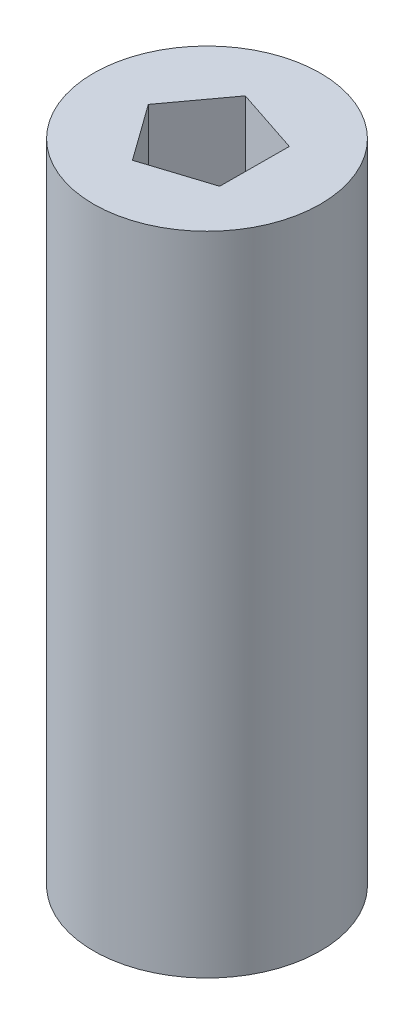
ISO-10303-21;
HEADER;
FILE_DESCRIPTION(('STEP AP214'),'2;1');
FILE_NAME('part.step','',(''),(''),'','','');
FILE_SCHEMA(('AUTOMOTIVE_DESIGN { 1 0 10303 214 1 1 1 1 }'));
ENDSEC;
DATA;
#1=APPLICATION_CONTEXT('core data for automotive mechanical design processes');
#2=APPLICATION_PROTOCOL_DEFINITION('international standard','automotive_design',2000,#1);
#3=PRODUCT_CONTEXT('',#1,'mechanical');
#4=PRODUCT('Part','Part','',(#3));
#5=PRODUCT_RELATED_PRODUCT_CATEGORY('part','',(#4));
#6=PRODUCT_DEFINITION_FORMATION('','',#4);
#7=PRODUCT_DEFINITION_CONTEXT('part definition',#1,'design');
#8=PRODUCT_DEFINITION('design','',#6,#7);
#9=PRODUCT_DEFINITION_SHAPE('','',#8);
#10=(LENGTH_UNIT() NAMED_UNIT(*) SI_UNIT(.MILLI.,.METRE.));
#11=(NAMED_UNIT(*) PLANE_ANGLE_UNIT() SI_UNIT($,.RADIAN.));
#12=(NAMED_UNIT(*) SI_UNIT($,.STERADIAN.) SOLID_ANGLE_UNIT());
#13=UNCERTAINTY_MEASURE_WITH_UNIT(LENGTH_MEASURE(1.E-05),#10,'distance_accuracy_value','');
#14=(GEOMETRIC_REPRESENTATION_CONTEXT(3) GLOBAL_UNCERTAINTY_ASSIGNED_CONTEXT((#13)) GLOBAL_UNIT_ASSIGNED_CONTEXT((#10,
#11,#12)) REPRESENTATION_CONTEXT('',''));
#15=CARTESIAN_POINT('',(0.,0.,0.));
#16=DIRECTION('',(0.,0.,1.));
#17=DIRECTION('',(1.,0.,0.));
#18=AXIS2_PLACEMENT_3D('',#15,#16,#17);
#19=CARTESIAN_POINT('',(0.,0.,0.));
#20=DIRECTION('',(0.,1.,0.));
#21=DIRECTION('',(0.,0.,1.));
#22=AXIS2_PLACEMENT_3D('',#19,#20,#21);
#23=PLANE('',#22);
#24=DIRECTION('',(-0.949362897335769,0.,-0.31418161811639));
#25=VECTOR('',#24,1.);
#26=CARTESIAN_POINT('',(0.660863497778587,0.,-1.99693186621156));
#27=LINE('',#26,#25);
#28=CARTESIAN_POINT('',(1.18615171025412,0.,-1.82309328347763));
#29=VERTEX_POINT('',#28);
#30=CARTESIAN_POINT('',(0.13557528530306,0.,-2.17077044894549));
#31=VERTEX_POINT('',#30);
#32=EDGE_CURVE('E211',#29,#31,#27,.T.);
#33=ORIENTED_EDGE('',*,*,#32,.T.);
#34=CARTESIAN_POINT('',(0.,0.,0.));
#35=DIRECTION('',(0.,-1.,0.));
#36=DIRECTION('',(0.,0.,-1.));
#37=AXIS2_PLACEMENT_3D('',#34,#35,#36);
#38=CIRCLE('',#37,2.175);
#39=EDGE_CURVE('E175',#31,#29,#38,.T.);
#40=ORIENTED_EDGE('',*,*,#39,.T.);
#41=EDGE_LOOP('',(#33,#40));
#42=FACE_BOUND('',#41,.T.);
#43=ADVANCED_FACE('F47',(#42),#23,.F.);
#44=DIRECTION('',(0.00543520610395782,0.,-0.999985229158215));
#45=VECTOR('',#44,1.);
#46=CARTESIAN_POINT('',(2.1034131157336,0.,0.011432652675684));
#47=LINE('',#46,#45);
#48=CARTESIAN_POINT('',(2.10040578344075,0.,0.56473050642641));
#49=VERTEX_POINT('',#48);
#50=CARTESIAN_POINT('',(2.10642044802644,0.,-0.541865201075042));
#51=VERTEX_POINT('',#50);
#52=EDGE_CURVE('E216',#49,#51,#47,.T.);
#53=ORIENTED_EDGE('',*,*,#52,.T.);
#54=EDGE_CURVE('E11',#51,#49,#38,.T.);
#55=ORIENTED_EDGE('',*,*,#54,.T.);
#56=EDGE_LOOP('',(#53,#55));
#57=FACE_BOUND('',#56,.T.);
#58=ADVANCED_FACE('F310',(#57),#23,.F.);
#59=DIRECTION('',(0.952722039443876,0.,-0.303843241751238));
#60=VECTOR('',#59,1.);
#61=CARTESIAN_POINT('',(0.639117300127091,0.,2.0039976341467));
#62=LINE('',#61,#60);
#63=CARTESIAN_POINT('',(0.111970454079122,0.,2.17211593093309));
#64=VERTEX_POINT('',#63);
#65=CARTESIAN_POINT('',(1.16626414617506,0.,1.83587933736032));
#66=VERTEX_POINT('',#65);
#67=EDGE_CURVE('E221',#64,#66,#62,.T.);
#68=ORIENTED_EDGE('',*,*,#67,.T.);
#69=EDGE_CURVE('E57',#66,#64,#38,.T.);
#70=ORIENTED_EDGE('',*,*,#69,.T.);
#71=EDGE_LOOP('',(#68,#70));
#72=FACE_BOUND('',#71,.T.);
#73=ADVANCED_FACE('F267',(#72),#23,.F.);
#74=DIRECTION('',(0.583379396103476,0.,0.812199778503998));
#75=VECTOR('',#74,1.);
#76=CARTESIAN_POINT('',(-1.70841690145699,0.,1.22710599860136));
#77=LINE('',#76,#75);
#78=CARTESIAN_POINT('',(-2.0312042370841,0.,0.777710966395365));
#79=VERTEX_POINT('',#78);
#80=CARTESIAN_POINT('',(-1.38562956582988,0.,1.67650103080735));
#81=VERTEX_POINT('',#80);
#82=EDGE_CURVE('E226',#79,#81,#77,.T.);
#83=ORIENTED_EDGE('',*,*,#82,.T.);
#84=EDGE_CURVE('E253',#81,#79,#38,.T.);
#85=ORIENTED_EDGE('',*,*,#84,.T.);
#86=EDGE_LOOP('',(#83,#85));
#87=FACE_BOUND('',#86,.T.);
#88=ADVANCED_FACE('F350',(#87),#23,.F.);
#89=DIRECTION('',(-0.59217374431554,0.,0.805810310521846));
#90=VECTOR('',#89,1.);
#91=CARTESIAN_POINT('',(-1.69497701218229,0.,-1.24560441921218));
#92=LINE('',#91,#90);
#93=CARTESIAN_POINT('',(-1.3673237106899,0.,-1.69146412027723));
#94=VERTEX_POINT('',#93);
#95=CARTESIAN_POINT('',(-2.02263031367468,0.,-0.799744718147141));
#96=VERTEX_POINT('',#95);
#97=EDGE_CURVE('E229',#94,#96,#92,.T.);
#98=ORIENTED_EDGE('',*,*,#97,.T.);
#99=EDGE_CURVE('E180',#96,#94,#38,.T.);
#100=ORIENTED_EDGE('',*,*,#99,.T.);
#101=EDGE_LOOP('',(#98,#100));
#102=FACE_BOUND('',#101,.T.);
#103=ADVANCED_FACE('F343',(#102),#23,.F.);
#104=CARTESIAN_POINT('',(0.660863497778587,8.,-1.99693186621156));
#105=DIRECTION('',(-0.31418161811639,0.,0.949362897335769));
#106=DIRECTION('',(0.949362897335769,0.,0.31418161811639));
#107=AXIS2_PLACEMENT_3D('',#104,#105,#106);
#108=PLANE('',#107);
#109=CARTESIAN_POINT('',(2.1117194241104,0.,-1.51678642986904));
#110=VERTEX_POINT('',#109);
#111=EDGE_CURVE('E207',#110,#29,#27,.T.);
#112=ORIENTED_EDGE('',*,*,#111,.F.);
#113=DIRECTION('',(0.,-1.,0.));
#114=VECTOR('',#113,1.);
#115=CARTESIAN_POINT('',(2.1117194241104,8.,-1.51678642986904));
#116=LINE('',#115,#114);
#117=CARTESIAN_POINT('',(2.1117194241104,8.,-1.51678642986904));
#118=VERTEX_POINT('',#117);
#119=EDGE_CURVE('E51',#118,#110,#116,.T.);
#120=ORIENTED_EDGE('',*,*,#119,.F.);
#121=DIRECTION('',(-0.949362897335769,0.,-0.31418161811639));
#122=VECTOR('',#121,1.);
#123=CARTESIAN_POINT('',(0.660863497778587,8.,-1.99693186621156));
#124=LINE('',#123,#122);
#125=CARTESIAN_POINT('',(-0.789992428553221,8.,-2.47707730255408));
#126=VERTEX_POINT('',#125);
#127=EDGE_CURVE('E181',#118,#126,#124,.T.);
#128=ORIENTED_EDGE('',*,*,#127,.T.);
#129=DIRECTION('',(0.,-1.,0.));
#130=VECTOR('',#129,1.);
#131=CARTESIAN_POINT('',(-0.789992428553221,8.,-2.47707730255408));
#132=LINE('',#131,#130);
#133=CARTESIAN_POINT('',(-0.789992428553221,0.,-2.47707730255408));
#134=VERTEX_POINT('',#133);
#135=EDGE_CURVE('E206',#126,#134,#132,.T.);
#136=ORIENTED_EDGE('',*,*,#135,.T.);
#137=EDGE_CURVE('E179',#31,#134,#27,.T.);
#138=ORIENTED_EDGE('',*,*,#137,.F.);
#139=ORIENTED_EDGE('',*,*,#32,.F.);
#140=EDGE_LOOP('',(#112,#120,#128,#136,#138,#139));
#141=FACE_BOUND('',#140,.T.);
#142=ADVANCED_FACE('F49',(#141),#108,.T.);
#143=CARTESIAN_POINT('',(2.1034131157336,8.,0.011432652675684));
#144=DIRECTION('',(-0.999985229158215,0.,-0.00543520610395781));
#145=DIRECTION('',(-0.00543520610395781,0.,0.999985229158215));
#146=AXIS2_PLACEMENT_3D('',#143,#144,#145);
#147=PLANE('',#146);
#148=CARTESIAN_POINT('',(2.0951068073568,0.,1.5396517352204));
#149=VERTEX_POINT('',#148);
#150=EDGE_CURVE('E212',#149,#49,#47,.T.);
#151=ORIENTED_EDGE('',*,*,#150,.F.);
#152=DIRECTION('',(0.,-1.,0.));
#153=VECTOR('',#152,1.);
#154=CARTESIAN_POINT('',(2.0951068073568,8.,1.5396517352204));
#155=LINE('',#154,#153);
#156=CARTESIAN_POINT('',(2.0951068073568,8.,1.5396517352204));
#157=VERTEX_POINT('',#156);
#158=EDGE_CURVE('E240',#157,#149,#155,.T.);
#159=ORIENTED_EDGE('',*,*,#158,.F.);
#160=DIRECTION('',(0.00543520610395782,0.,-0.999985229158215));
#161=VECTOR('',#160,1.);
#162=CARTESIAN_POINT('',(2.1034131157336,8.,0.011432652675684));
#163=LINE('',#162,#161);
#164=EDGE_CURVE('E185',#157,#118,#163,.T.);
#165=ORIENTED_EDGE('',*,*,#164,.T.);
#166=ORIENTED_EDGE('',*,*,#119,.T.);
#167=EDGE_CURVE('E210',#51,#110,#47,.T.);
#168=ORIENTED_EDGE('',*,*,#167,.F.);
#169=ORIENTED_EDGE('',*,*,#52,.F.);
#170=EDGE_LOOP('',(#151,#159,#165,#166,#168,#169));
#171=FACE_BOUND('',#170,.T.);
#172=ADVANCED_FACE('F311',(#171),#147,.T.);
#173=CARTESIAN_POINT('',(0.639117300127091,8.,2.0039976341467));
#174=DIRECTION('',(-0.303843241751238,0.,-0.952722039443876));
#175=DIRECTION('',(-0.952722039443876,0.,0.303843241751238));
#176=AXIS2_PLACEMENT_3D('',#173,#174,#175);
#177=PLANE('',#176);
#178=CARTESIAN_POINT('',(-0.816872207102617,0.,2.468343533073));
#179=VERTEX_POINT('',#178);
#180=EDGE_CURVE('E217',#179,#64,#62,.T.);
#181=ORIENTED_EDGE('',*,*,#180,.F.);
#182=DIRECTION('',(0.,-1.,0.));
#183=VECTOR('',#182,1.);
#184=CARTESIAN_POINT('',(-0.816872207102617,8.,2.468343533073));
#185=LINE('',#184,#183);
#186=CARTESIAN_POINT('',(-0.816872207102617,8.,2.468343533073));
#187=VERTEX_POINT('',#186);
#188=EDGE_CURVE('E237',#187,#179,#185,.T.);
#189=ORIENTED_EDGE('',*,*,#188,.F.);
#190=DIRECTION('',(0.952722039443876,0.,-0.303843241751238));
#191=VECTOR('',#190,1.);
#192=CARTESIAN_POINT('',(0.639117300127091,8.,2.0039976341467));
#193=LINE('',#192,#191);
#194=EDGE_CURVE('E190',#187,#157,#193,.T.);
#195=ORIENTED_EDGE('',*,*,#194,.T.);
#196=ORIENTED_EDGE('',*,*,#158,.T.);
#197=EDGE_CURVE('E215',#66,#149,#62,.T.);
#198=ORIENTED_EDGE('',*,*,#197,.F.);
#199=ORIENTED_EDGE('',*,*,#67,.F.);
#200=EDGE_LOOP('',(#181,#189,#195,#196,#198,#199));
#201=FACE_BOUND('',#200,.T.);
#202=ADVANCED_FACE('F272',(#201),#177,.T.);
#203=CARTESIAN_POINT('',(-1.70841690145699,8.,1.22710599860136));
#204=DIRECTION('',(0.812199778503998,0.,-0.583379396103476));
#205=DIRECTION('',(-0.583379396103476,0.,-0.812199778503998));
#206=AXIS2_PLACEMENT_3D('',#203,#204,#205);
#207=PLANE('',#206);
#208=CARTESIAN_POINT('',(-2.59996159581136,0.,-0.0141315358702892));
#209=VERTEX_POINT('',#208);
#210=EDGE_CURVE('E222',#209,#79,#77,.T.);
#211=ORIENTED_EDGE('',*,*,#210,.F.);
#212=DIRECTION('',(0.,-1.,0.));
#213=VECTOR('',#212,1.);
#214=CARTESIAN_POINT('',(-2.59996159581136,8.,-0.0141315358702892));
#215=LINE('',#214,#213);
#216=CARTESIAN_POINT('',(-2.59996159581136,8.,-0.0141315358702892));
#217=VERTEX_POINT('',#216);
#218=EDGE_CURVE('E233',#217,#209,#215,.T.);
#219=ORIENTED_EDGE('',*,*,#218,.F.);
#220=DIRECTION('',(0.583379396103476,0.,0.812199778503998));
#221=VECTOR('',#220,1.);
#222=CARTESIAN_POINT('',(-1.70841690145699,8.,1.22710599860136));
#223=LINE('',#222,#221);
#224=EDGE_CURVE('E194',#217,#187,#223,.T.);
#225=ORIENTED_EDGE('',*,*,#224,.T.);
#226=ORIENTED_EDGE('',*,*,#188,.T.);
#227=EDGE_CURVE('E220',#81,#179,#77,.T.);
#228=ORIENTED_EDGE('',*,*,#227,.F.);
#229=ORIENTED_EDGE('',*,*,#82,.F.);
#230=EDGE_LOOP('',(#211,#219,#225,#226,#228,#229));
#231=FACE_BOUND('',#230,.T.);
#232=ADVANCED_FACE('F329',(#231),#207,.T.);
#233=CARTESIAN_POINT('',(-1.69497701218229,8.,-1.24560441921218));
#234=DIRECTION('',(0.805810310521846,0.,0.59217374431554));
#235=DIRECTION('',(0.59217374431554,0.,-0.805810310521846));
#236=AXIS2_PLACEMENT_3D('',#233,#234,#235);
#237=PLANE('',#236);
#238=EDGE_CURVE('E186',#134,#94,#92,.T.);
#239=ORIENTED_EDGE('',*,*,#238,.F.);
#240=ORIENTED_EDGE('',*,*,#135,.F.);
#241=DIRECTION('',(-0.59217374431554,0.,0.805810310521846));
#242=VECTOR('',#241,1.);
#243=CARTESIAN_POINT('',(-1.69497701218229,8.,-1.24560441921218));
#244=LINE('',#243,#242);
#245=EDGE_CURVE('E198',#126,#217,#244,.T.);
#246=ORIENTED_EDGE('',*,*,#245,.T.);
#247=ORIENTED_EDGE('',*,*,#218,.T.);
#248=EDGE_CURVE('E225',#96,#209,#92,.T.);
#249=ORIENTED_EDGE('',*,*,#248,.F.);
#250=ORIENTED_EDGE('',*,*,#97,.F.);
#251=EDGE_LOOP('',(#239,#240,#246,#247,#249,#250));
#252=FACE_BOUND('',#251,.T.);
#253=ADVANCED_FACE('F323',(#252),#237,.T.);
#254=CARTESIAN_POINT('',(0.,8.,0.));
#255=DIRECTION('',(0.,-1.,0.));
#256=DIRECTION('',(0.,0.,-1.));
#257=AXIS2_PLACEMENT_3D('',#254,#255,#256);
#258=CYLINDRICAL_SURFACE('',#257,5.);
#259=CARTESIAN_POINT('',(0.,8.,0.));
#260=DIRECTION('',(0.,1.,0.));
#261=DIRECTION('',(0.,0.,1.));
#262=AXIS2_PLACEMENT_3D('',#259,#260,#261);
#263=CIRCLE('',#262,5.);
#264=CARTESIAN_POINT('',(0.,8.,5.));
#265=VERTEX_POINT('',#264);
#266=EDGE_CURVE('E202',#265,#265,#263,.T.);
#267=ORIENTED_EDGE('',*,*,#266,.F.);
#268=EDGE_LOOP('',(#267));
#269=FACE_BOUND('',#268,.T.);
#270=CARTESIAN_POINT('',(0.,-20.5,0.));
#271=DIRECTION('',(0.,-1.,0.));
#272=DIRECTION('',(0.,0.,-1.));
#273=AXIS2_PLACEMENT_3D('',#270,#271,#272);
#274=CIRCLE('',#273,5.);
#275=CARTESIAN_POINT('',(0.,-20.5,-5.));
#276=VERTEX_POINT('',#275);
#277=EDGE_CURVE('E161',#276,#276,#274,.T.);
#278=ORIENTED_EDGE('',*,*,#277,.F.);
#279=EDGE_LOOP('',(#278));
#280=FACE_BOUND('',#279,.T.);
#281=ADVANCED_FACE('F458',(#269,#280),#258,.T.);
#282=CARTESIAN_POINT('',(0.,8.,0.));
#283=DIRECTION('',(0.,1.,0.));
#284=DIRECTION('',(0.,0.,1.));
#285=AXIS2_PLACEMENT_3D('',#282,#283,#284);
#286=PLANE('',#285);
#287=ORIENTED_EDGE('',*,*,#127,.F.);
#288=ORIENTED_EDGE('',*,*,#164,.F.);
#289=ORIENTED_EDGE('',*,*,#194,.F.);
#290=ORIENTED_EDGE('',*,*,#224,.F.);
#291=ORIENTED_EDGE('',*,*,#245,.F.);
#292=EDGE_LOOP('',(#287,#288,#289,#290,#291));
#293=FACE_BOUND('',#292,.T.);
#294=ORIENTED_EDGE('',*,*,#266,.T.);
#295=EDGE_LOOP('',(#294));
#296=FACE_BOUND('',#295,.T.);
#297=ADVANCED_FACE('F318',(#293,#296),#286,.T.);
#298=CARTESIAN_POINT('',(0.,0.,0.));
#299=DIRECTION('',(0.,-1.,0.));
#300=DIRECTION('',(0.,0.,-1.));
#301=AXIS2_PLACEMENT_3D('',#298,#299,#300);
#302=PLANE('',#301);
#303=EDGE_CURVE('E73',#94,#31,#38,.T.);
#304=ORIENTED_EDGE('',*,*,#303,.T.);
#305=ORIENTED_EDGE('',*,*,#137,.T.);
#306=ORIENTED_EDGE('',*,*,#238,.T.);
#307=EDGE_LOOP('',(#304,#305,#306));
#308=FACE_BOUND('',#307,.T.);
#309=ADVANCED_FACE('F294',(#308),#302,.F.);
#310=EDGE_CURVE('E284',#79,#96,#38,.T.);
#311=ORIENTED_EDGE('',*,*,#310,.T.);
#312=ORIENTED_EDGE('',*,*,#248,.T.);
#313=ORIENTED_EDGE('',*,*,#210,.T.);
#314=EDGE_LOOP('',(#311,#312,#313));
#315=FACE_BOUND('',#314,.T.);
#316=ADVANCED_FACE('F327',(#315),#302,.F.);
#317=EDGE_CURVE('E279',#64,#81,#38,.T.);
#318=ORIENTED_EDGE('',*,*,#317,.T.);
#319=ORIENTED_EDGE('',*,*,#227,.T.);
#320=ORIENTED_EDGE('',*,*,#180,.T.);
#321=EDGE_LOOP('',(#318,#319,#320));
#322=FACE_BOUND('',#321,.T.);
#323=ADVANCED_FACE('F332',(#322),#302,.F.);
#324=EDGE_CURVE('E277',#49,#66,#38,.T.);
#325=ORIENTED_EDGE('',*,*,#324,.T.);
#326=ORIENTED_EDGE('',*,*,#197,.T.);
#327=ORIENTED_EDGE('',*,*,#150,.T.);
#328=EDGE_LOOP('',(#325,#326,#327));
#329=FACE_BOUND('',#328,.T.);
#330=ADVANCED_FACE('F276',(#329),#302,.F.);
#331=ORIENTED_EDGE('',*,*,#167,.T.);
#332=ORIENTED_EDGE('',*,*,#111,.T.);
#333=EDGE_CURVE('E59',#29,#51,#38,.T.);
#334=ORIENTED_EDGE('',*,*,#333,.T.);
#335=EDGE_LOOP('',(#331,#332,#334));
#336=FACE_BOUND('',#335,.T.);
#337=ADVANCED_FACE('F313',(#336),#302,.F.);
#338=CARTESIAN_POINT('',(0.,-6.,0.));
#339=DIRECTION('',(0.,1.,0.));
#340=DIRECTION('',(0.,0.,1.));
#341=AXIS2_PLACEMENT_3D('',#338,#339,#340);
#342=CYLINDRICAL_SURFACE('',#341,2.175);
#343=CARTESIAN_POINT('',(0.,-6.,0.));
#344=DIRECTION('',(0.,-1.,0.));
#345=DIRECTION('',(0.,0.,-1.));
#346=AXIS2_PLACEMENT_3D('',#343,#344,#345);
#347=CIRCLE('',#346,2.175);
#348=CARTESIAN_POINT('',(0.,-6.,-2.175));
#349=VERTEX_POINT('',#348);
#350=EDGE_CURVE('E156',#349,#349,#347,.T.);
#351=ORIENTED_EDGE('',*,*,#350,.T.);
#352=EDGE_LOOP('',(#351));
#353=FACE_BOUND('',#352,.T.);
#354=ORIENTED_EDGE('',*,*,#39,.F.);
#355=ORIENTED_EDGE('',*,*,#303,.F.);
#356=ORIENTED_EDGE('',*,*,#99,.F.);
#357=ORIENTED_EDGE('',*,*,#310,.F.);
#358=ORIENTED_EDGE('',*,*,#84,.F.);
#359=ORIENTED_EDGE('',*,*,#317,.F.);
#360=ORIENTED_EDGE('',*,*,#69,.F.);
#361=ORIENTED_EDGE('',*,*,#324,.F.);
#362=ORIENTED_EDGE('',*,*,#54,.F.);
#363=ORIENTED_EDGE('',*,*,#333,.F.);
#364=EDGE_LOOP('',(#354,#355,#356,#357,#358,#359,#360,#361,#362,#363));
#365=FACE_BOUND('',#364,.T.);
#366=ADVANCED_FACE('F298',(#353,#365),#342,.F.);
#367=CARTESIAN_POINT('',(0.,-6.,0.));
#368=DIRECTION('',(0.,-1.,0.));
#369=DIRECTION('',(0.,0.,-1.));
#370=AXIS2_PLACEMENT_3D('',#367,#368,#369);
#371=PLANE('',#370);
#372=ORIENTED_EDGE('',*,*,#350,.F.);
#373=EDGE_LOOP('',(#372));
#374=FACE_BOUND('',#373,.T.);
#375=ADVANCED_FACE('F407',(#374),#371,.F.);
#376=CARTESIAN_POINT('',(0.,-20.5,2.5));
#377=DIRECTION('',(0.,0.,1.));
#378=DIRECTION('',(1.,0.,0.));
#379=AXIS2_PLACEMENT_3D('',#376,#377,#378);
#380=PLANE('',#379);
#381=DIRECTION('',(1.,0.,0.));
#382=VECTOR('',#381,1.);
#383=CARTESIAN_POINT('',(0.,-7.5,2.5));
#384=LINE('',#383,#382);
#385=CARTESIAN_POINT('',(-1.74714052096561,-7.5,2.5));
#386=VERTEX_POINT('',#385);
#387=CARTESIAN_POINT('',(1.74714052096561,-7.5,2.5));
#388=VERTEX_POINT('',#387);
#389=EDGE_CURVE('E153',#386,#388,#384,.T.);
#390=ORIENTED_EDGE('',*,*,#389,.T.);
#391=DIRECTION('',(0.,1.,0.));
#392=VECTOR('',#391,1.);
#393=CARTESIAN_POINT('',(1.74714052096561,-20.5,2.5));
#394=LINE('',#393,#392);
#395=CARTESIAN_POINT('',(1.74714052096561,-20.5,2.5));
#396=VERTEX_POINT('',#395);
#397=EDGE_CURVE('E151',#396,#388,#394,.T.);
#398=ORIENTED_EDGE('',*,*,#397,.F.);
#399=DIRECTION('',(1.,0.,0.));
#400=VECTOR('',#399,1.);
#401=CARTESIAN_POINT('',(0.,-20.5,2.5));
#402=LINE('',#401,#400);
#403=CARTESIAN_POINT('',(-1.74714052096561,-20.5,2.5));
#404=VERTEX_POINT('',#403);
#405=EDGE_CURVE('E140',#404,#396,#402,.T.);
#406=ORIENTED_EDGE('',*,*,#405,.F.);
#407=DIRECTION('',(0.,1.,0.));
#408=VECTOR('',#407,1.);
#409=CARTESIAN_POINT('',(-1.74714052096561,-20.5,2.5));
#410=LINE('',#409,#408);
#411=EDGE_CURVE('E157',#404,#386,#410,.T.);
#412=ORIENTED_EDGE('',*,*,#411,.T.);
#413=EDGE_LOOP('',(#390,#398,#406,#412));
#414=FACE_BOUND('',#413,.T.);
#415=ADVANCED_FACE('F152',(#414),#380,.F.);
#416=CARTESIAN_POINT('',(0.,-20.5,0.));
#417=DIRECTION('',(0.,1.,0.));
#418=DIRECTION('',(0.,0.,1.));
#419=AXIS2_PLACEMENT_3D('',#416,#417,#418);
#420=CYLINDRICAL_SURFACE('',#419,3.05);
#421=CARTESIAN_POINT('',(0.,-7.5,0.));
#422=DIRECTION('',(0.,-1.,0.));
#423=DIRECTION('',(0.,0.,-1.));
#424=AXIS2_PLACEMENT_3D('',#421,#422,#423);
#425=CIRCLE('',#424,3.05);
#426=EDGE_CURVE('E65',#386,#388,#425,.T.);
#427=ORIENTED_EDGE('',*,*,#426,.F.);
#428=ORIENTED_EDGE('',*,*,#411,.F.);
#429=CARTESIAN_POINT('',(0.,-20.5,0.));
#430=DIRECTION('',(0.,-1.,0.));
#431=DIRECTION('',(0.,0.,-1.));
#432=AXIS2_PLACEMENT_3D('',#429,#430,#431);
#433=CIRCLE('',#432,3.05);
#434=EDGE_CURVE('E145',#404,#396,#433,.T.);
#435=ORIENTED_EDGE('',*,*,#434,.T.);
#436=ORIENTED_EDGE('',*,*,#397,.T.);
#437=EDGE_LOOP('',(#427,#428,#435,#436));
#438=FACE_BOUND('',#437,.T.);
#439=ADVANCED_FACE('F159',(#438),#420,.F.);
#440=CARTESIAN_POINT('',(0.,-20.5,0.));
#441=DIRECTION('',(0.,-1.,0.));
#442=DIRECTION('',(0.,0.,-1.));
#443=AXIS2_PLACEMENT_3D('',#440,#441,#442);
#444=PLANE('',#443);
#445=ORIENTED_EDGE('',*,*,#405,.T.);
#446=ORIENTED_EDGE('',*,*,#434,.F.);
#447=EDGE_LOOP('',(#445,#446));
#448=FACE_BOUND('',#447,.T.);
#449=ORIENTED_EDGE('',*,*,#277,.T.);
#450=EDGE_LOOP('',(#449));
#451=FACE_BOUND('',#450,.T.);
#452=ADVANCED_FACE('F142',(#448,#451),#444,.T.);
#453=CARTESIAN_POINT('',(0.,-7.5,0.));
#454=DIRECTION('',(0.,-1.,0.));
#455=DIRECTION('',(0.,0.,-1.));
#456=AXIS2_PLACEMENT_3D('',#453,#454,#455);
#457=PLANE('',#456);
#458=ORIENTED_EDGE('',*,*,#426,.T.);
#459=ORIENTED_EDGE('',*,*,#389,.F.);
#460=EDGE_LOOP('',(#458,#459));
#461=FACE_BOUND('',#460,.T.);
#462=ADVANCED_FACE('F421',(#461),#457,.T.);
#463=CLOSED_SHELL('',(#43,#58,#73,#88,#103,#142,#172,#202,#232,#253,#281,#297,#309,#316,#323,
#330,#337,#366,#375,#415,#439,#452,#462));
#464=MANIFOLD_SOLID_BREP('B2',#463);
#465=ADVANCED_BREP_SHAPE_REPRESENTATION('',(#18,#464),#14);
#466=SHAPE_DEFINITION_REPRESENTATION(#9,#465);
ENDSEC;
END-ISO-10303-21;
